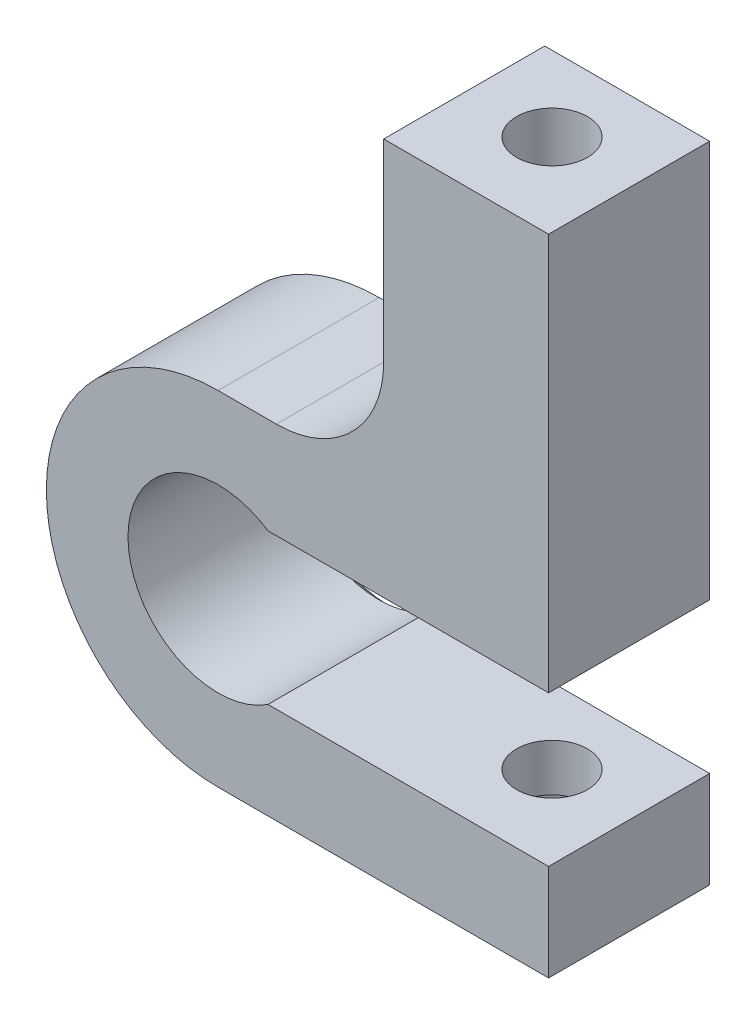
ISO-10303-21;
HEADER;
FILE_DESCRIPTION(('STEP AP214'),'2;1');
FILE_NAME('part.step','',(''),(''),'','','');
FILE_SCHEMA(('AUTOMOTIVE_DESIGN { 1 0 10303 214 1 1 1 1 }'));
ENDSEC;
DATA;
#1=APPLICATION_CONTEXT('core data for automotive mechanical design processes');
#2=APPLICATION_PROTOCOL_DEFINITION('international standard','automotive_design',2000,#1);
#3=PRODUCT_CONTEXT('',#1,'mechanical');
#4=PRODUCT('Part','Part','',(#3));
#5=PRODUCT_RELATED_PRODUCT_CATEGORY('part','',(#4));
#6=PRODUCT_DEFINITION_FORMATION('','',#4);
#7=PRODUCT_DEFINITION_CONTEXT('part definition',#1,'design');
#8=PRODUCT_DEFINITION('design','',#6,#7);
#9=PRODUCT_DEFINITION_SHAPE('','',#8);
#10=(LENGTH_UNIT() NAMED_UNIT(*) SI_UNIT(.MILLI.,.METRE.));
#11=(NAMED_UNIT(*) PLANE_ANGLE_UNIT() SI_UNIT($,.RADIAN.));
#12=(NAMED_UNIT(*) SI_UNIT($,.STERADIAN.) SOLID_ANGLE_UNIT());
#13=UNCERTAINTY_MEASURE_WITH_UNIT(LENGTH_MEASURE(1.E-05),#10,'distance_accuracy_value','');
#14=(GEOMETRIC_REPRESENTATION_CONTEXT(3) GLOBAL_UNCERTAINTY_ASSIGNED_CONTEXT((#13)) GLOBAL_UNIT_ASSIGNED_CONTEXT((#10,
#11,#12)) REPRESENTATION_CONTEXT('',''));
#15=CARTESIAN_POINT('',(0.,0.,0.));
#16=DIRECTION('',(0.,0.,1.));
#17=DIRECTION('',(1.,0.,0.));
#18=AXIS2_PLACEMENT_3D('',#15,#16,#17);
#19=CARTESIAN_POINT('',(11.54898322,8.,4.));
#20=DIRECTION('',(0.,-1.,0.));
#21=DIRECTION('',(0.,0.,-1.));
#22=AXIS2_PLACEMENT_3D('',#19,#20,#21);
#23=CYLINDRICAL_SURFACE('',#22,1.65);
#24=CARTESIAN_POINT('',(11.54898322,-3.5,4.));
#25=DIRECTION('',(0.,-1.,0.));
#26=DIRECTION('',(1.,0.,0.));
#27=AXIS2_PLACEMENT_3D('',#24,#25,#26);
#28=CIRCLE('',#27,1.65);
#29=CARTESIAN_POINT('',(13.19898322,-3.5,4.));
#30=VERTEX_POINT('',#29);
#31=EDGE_CURVE('E190',#30,#30,#28,.T.);
#32=ORIENTED_EDGE('',*,*,#31,.F.);
#33=EDGE_LOOP('',(#32));
#34=FACE_BOUND('',#33,.T.);
#35=CARTESIAN_POINT('',(11.54898322,-5.7,4.));
#36=DIRECTION('',(0.,-1.,0.));
#37=DIRECTION('',(0.,0.,-1.));
#38=AXIS2_PLACEMENT_3D('',#35,#36,#37);
#39=CIRCLE('',#38,1.65);
#40=CARTESIAN_POINT('',(11.54898322,-5.7,2.35));
#41=VERTEX_POINT('',#40);
#42=EDGE_CURVE('E183',#41,#41,#39,.F.);
#43=ORIENTED_EDGE('',*,*,#42,.F.);
#44=EDGE_LOOP('',(#43));
#45=FACE_BOUND('',#44,.T.);
#46=ADVANCED_FACE('F41',(#34,#45),#23,.F.);
#47=CARTESIAN_POINT('',(0.,0.,8.));
#48=DIRECTION('',(0.,0.,-1.));
#49=DIRECTION('',(-1.,0.,0.));
#50=AXIS2_PLACEMENT_3D('',#47,#48,#49);
#51=CYLINDRICAL_SURFACE('',#50,4.2);
#52=DIRECTION('',(0.,0.,-1.));
#53=VECTOR('',#52,1.);
#54=CARTESIAN_POINT('',(2.32163735324878,-3.5,8.));
#55=LINE('',#54,#53);
#56=CARTESIAN_POINT('',(2.32163735324878,-3.5,8.));
#57=VERTEX_POINT('',#56);
#58=CARTESIAN_POINT('',(2.32163735324878,-3.5,0.499999999999997));
#59=VERTEX_POINT('',#58);
#60=EDGE_CURVE('E202',#57,#59,#55,.T.);
#61=ORIENTED_EDGE('',*,*,#60,.T.);
#62=CARTESIAN_POINT('',(0.,0.,0.499999999999997));
#63=DIRECTION('',(0.,0.,1.));
#64=DIRECTION('',(1.,0.,0.));
#65=AXIS2_PLACEMENT_3D('',#62,#63,#64);
#66=CIRCLE('',#65,4.2);
#67=CARTESIAN_POINT('',(2.32163735324878,3.5,0.499999999999997));
#68=VERTEX_POINT('',#67);
#69=EDGE_CURVE('E259',#59,#68,#66,.F.);
#70=ORIENTED_EDGE('',*,*,#69,.T.);
#71=DIRECTION('',(0.,0.,-1.));
#72=VECTOR('',#71,1.);
#73=CARTESIAN_POINT('',(2.32163735324878,3.5,8.));
#74=LINE('',#73,#72);
#75=CARTESIAN_POINT('',(2.32163735324878,3.5,8.));
#76=VERTEX_POINT('',#75);
#77=EDGE_CURVE('E219',#76,#68,#74,.T.);
#78=ORIENTED_EDGE('',*,*,#77,.F.);
#79=CARTESIAN_POINT('',(0.,0.,8.));
#80=DIRECTION('',(0.,0.,-1.));
#81=DIRECTION('',(1.,0.,0.));
#82=AXIS2_PLACEMENT_3D('',#79,#80,#81);
#83=CIRCLE('',#82,4.2);
#84=EDGE_CURVE('E189',#57,#76,#83,.T.);
#85=ORIENTED_EDGE('',*,*,#84,.F.);
#86=EDGE_LOOP('',(#61,#70,#78,#85));
#87=FACE_BOUND('',#86,.T.);
#88=ADVANCED_FACE('F382',(#87),#51,.F.);
#89=CARTESIAN_POINT('',(15.38898322,3.5,8.));
#90=DIRECTION('',(0.,1.,0.));
#91=DIRECTION('',(-1.,0.,0.));
#92=AXIS2_PLACEMENT_3D('',#89,#90,#91);
#93=PLANE('',#92);
#94=ORIENTED_EDGE('',*,*,#77,.T.);
#95=DIRECTION('',(1.,0.,0.));
#96=VECTOR('',#95,1.);
#97=CARTESIAN_POINT('',(15.38898322,3.5,0.499999999999997));
#98=LINE('',#97,#96);
#99=CARTESIAN_POINT('',(15.38898322,3.5,0.499999999999997));
#100=VERTEX_POINT('',#99);
#101=EDGE_CURVE('E233',#68,#100,#98,.T.);
#102=ORIENTED_EDGE('',*,*,#101,.T.);
#103=DIRECTION('',(0.,0.,-1.));
#104=VECTOR('',#103,1.);
#105=CARTESIAN_POINT('',(15.38898322,3.5,8.));
#106=LINE('',#105,#104);
#107=CARTESIAN_POINT('',(15.38898322,3.5,8.));
#108=VERTEX_POINT('',#107);
#109=EDGE_CURVE('E217',#108,#100,#106,.T.);
#110=ORIENTED_EDGE('',*,*,#109,.F.);
#111=DIRECTION('',(1.,0.,0.));
#112=VECTOR('',#111,1.);
#113=CARTESIAN_POINT('',(15.38898322,3.5,8.));
#114=LINE('',#113,#112);
#115=EDGE_CURVE('E169',#76,#108,#114,.T.);
#116=ORIENTED_EDGE('',*,*,#115,.F.);
#117=EDGE_LOOP('',(#94,#102,#110,#116));
#118=FACE_BOUND('',#117,.T.);
#119=CARTESIAN_POINT('',(11.54898322,3.5,4.));
#120=DIRECTION('',(0.,1.,0.));
#121=DIRECTION('',(-1.,0.,0.));
#122=AXIS2_PLACEMENT_3D('',#119,#120,#121);
#123=CIRCLE('',#122,1.65);
#124=CARTESIAN_POINT('',(9.89898322,3.5,4.));
#125=VERTEX_POINT('',#124);
#126=EDGE_CURVE('E186',#125,#125,#123,.T.);
#127=ORIENTED_EDGE('',*,*,#126,.T.);
#128=EDGE_LOOP('',(#127));
#129=FACE_BOUND('',#128,.T.);
#130=ADVANCED_FACE('F390',(#118,#129),#93,.F.);
#131=CARTESIAN_POINT('',(15.38898322,8.,8.));
#132=DIRECTION('',(-1.,0.,0.));
#133=DIRECTION('',(0.,0.,1.));
#134=AXIS2_PLACEMENT_3D('',#131,#132,#133);
#135=PLANE('',#134);
#136=ORIENTED_EDGE('',*,*,#109,.T.);
#137=DIRECTION('',(0.,1.,0.));
#138=VECTOR('',#137,1.);
#139=CARTESIAN_POINT('',(15.38898322,8.,0.499999999999997));
#140=LINE('',#139,#138);
#141=CARTESIAN_POINT('',(15.38898322,22.,0.499999999999997));
#142=VERTEX_POINT('',#141);
#143=EDGE_CURVE('E11',#100,#142,#140,.T.);
#144=ORIENTED_EDGE('',*,*,#143,.T.);
#145=DIRECTION('',(0.,0.,1.));
#146=VECTOR('',#145,1.);
#147=CARTESIAN_POINT('',(15.38898322,22.,0.));
#148=LINE('',#147,#146);
#149=CARTESIAN_POINT('',(15.38898322,22.,8.));
#150=VERTEX_POINT('',#149);
#151=EDGE_CURVE('E156',#142,#150,#148,.T.);
#152=ORIENTED_EDGE('',*,*,#151,.T.);
#153=DIRECTION('',(0.,1.,0.));
#154=VECTOR('',#153,1.);
#155=CARTESIAN_POINT('',(15.38898322,8.,8.));
#156=LINE('',#155,#154);
#157=EDGE_CURVE('E159',#108,#150,#156,.T.);
#158=ORIENTED_EDGE('',*,*,#157,.F.);
#159=EDGE_LOOP('',(#136,#144,#152,#158));
#160=FACE_BOUND('',#159,.T.);
#161=ADVANCED_FACE('F158',(#160),#135,.F.);
#162=CARTESIAN_POINT('',(0.,8.,8.));
#163=DIRECTION('',(0.,-1.,0.));
#164=DIRECTION('',(0.,0.,-1.));
#165=AXIS2_PLACEMENT_3D('',#162,#163,#164);
#166=PLANE('',#165);
#167=DIRECTION('',(0.,0.,-1.));
#168=VECTOR('',#167,1.);
#169=CARTESIAN_POINT('',(2.70898322,8.,8.));
#170=LINE('',#169,#168);
#171=CARTESIAN_POINT('',(2.70898322,8.,8.));
#172=VERTEX_POINT('',#171);
#173=CARTESIAN_POINT('',(2.70898322,8.,0.499999999999997));
#174=VERTEX_POINT('',#173);
#175=EDGE_CURVE('E222',#172,#174,#170,.T.);
#176=ORIENTED_EDGE('',*,*,#175,.T.);
#177=DIRECTION('',(-1.,0.,0.));
#178=VECTOR('',#177,1.);
#179=CARTESIAN_POINT('',(0.,8.,0.499999999999997));
#180=LINE('',#179,#178);
#181=CARTESIAN_POINT('',(0.,8.,0.499999999999997));
#182=VERTEX_POINT('',#181);
#183=EDGE_CURVE('E269',#174,#182,#180,.T.);
#184=ORIENTED_EDGE('',*,*,#183,.T.);
#185=DIRECTION('',(0.,0.,-1.));
#186=VECTOR('',#185,1.);
#187=CARTESIAN_POINT('',(0.,8.,8.));
#188=LINE('',#187,#186);
#189=CARTESIAN_POINT('',(0.,8.,8.));
#190=VERTEX_POINT('',#189);
#191=EDGE_CURVE('E214',#190,#182,#188,.T.);
#192=ORIENTED_EDGE('',*,*,#191,.F.);
#193=DIRECTION('',(-1.,0.,0.));
#194=VECTOR('',#193,1.);
#195=CARTESIAN_POINT('',(0.,8.,8.));
#196=LINE('',#195,#194);
#197=EDGE_CURVE('E171',#172,#190,#196,.T.);
#198=ORIENTED_EDGE('',*,*,#197,.F.);
#199=EDGE_LOOP('',(#176,#184,#192,#198));
#200=FACE_BOUND('',#199,.T.);
#201=ADVANCED_FACE('F370',(#200),#166,.F.);
#202=CARTESIAN_POINT('',(0.,0.,8.));
#203=DIRECTION('',(0.,0.,-1.));
#204=DIRECTION('',(-1.,0.,0.));
#205=AXIS2_PLACEMENT_3D('',#202,#203,#204);
#206=CYLINDRICAL_SURFACE('',#205,8.);
#207=ORIENTED_EDGE('',*,*,#191,.T.);
#208=CARTESIAN_POINT('',(0.,0.,0.499999999999997));
#209=DIRECTION('',(0.,0.,1.));
#210=DIRECTION('',(1.,0.,0.));
#211=AXIS2_PLACEMENT_3D('',#208,#209,#210);
#212=CIRCLE('',#211,8.);
#213=CARTESIAN_POINT('',(0.,-8.,0.499999999999997));
#214=VERTEX_POINT('',#213);
#215=EDGE_CURVE('E267',#182,#214,#212,.T.);
#216=ORIENTED_EDGE('',*,*,#215,.T.);
#217=DIRECTION('',(0.,0.,-1.));
#218=VECTOR('',#217,1.);
#219=CARTESIAN_POINT('',(0.,-8.,8.));
#220=LINE('',#219,#218);
#221=CARTESIAN_POINT('',(0.,-8.,8.));
#222=VERTEX_POINT('',#221);
#223=EDGE_CURVE('E211',#222,#214,#220,.T.);
#224=ORIENTED_EDGE('',*,*,#223,.F.);
#225=CARTESIAN_POINT('',(0.,0.,8.));
#226=DIRECTION('',(0.,0.,1.));
#227=DIRECTION('',(1.,0.,0.));
#228=AXIS2_PLACEMENT_3D('',#225,#226,#227);
#229=CIRCLE('',#228,8.);
#230=EDGE_CURVE('E194',#190,#222,#229,.T.);
#231=ORIENTED_EDGE('',*,*,#230,.F.);
#232=EDGE_LOOP('',(#207,#216,#224,#231));
#233=FACE_BOUND('',#232,.T.);
#234=ADVANCED_FACE('F443',(#233),#206,.T.);
#235=CARTESIAN_POINT('',(0.,-8.,8.));
#236=DIRECTION('',(0.,1.,0.));
#237=DIRECTION('',(0.,0.,1.));
#238=AXIS2_PLACEMENT_3D('',#235,#236,#237);
#239=PLANE('',#238);
#240=CARTESIAN_POINT('',(11.54898322,-8.,4.));
#241=DIRECTION('',(0.,-1.,0.));
#242=DIRECTION('',(0.,0.,-1.));
#243=AXIS2_PLACEMENT_3D('',#240,#241,#242);
#244=CIRCLE('',#243,3.);
#245=CARTESIAN_POINT('',(11.54898322,-8.,0.999999999999999));
#246=VERTEX_POINT('',#245);
#247=EDGE_CURVE('E176',#246,#246,#244,.T.);
#248=ORIENTED_EDGE('',*,*,#247,.F.);
#249=EDGE_LOOP('',(#248));
#250=FACE_BOUND('',#249,.T.);
#251=ORIENTED_EDGE('',*,*,#223,.T.);
#252=DIRECTION('',(1.,0.,0.));
#253=VECTOR('',#252,1.);
#254=CARTESIAN_POINT('',(0.,-8.,0.499999999999997));
#255=LINE('',#254,#253);
#256=CARTESIAN_POINT('',(15.38898322,-8.,0.499999999999997));
#257=VERTEX_POINT('',#256);
#258=EDGE_CURVE('E265',#214,#257,#255,.T.);
#259=ORIENTED_EDGE('',*,*,#258,.T.);
#260=DIRECTION('',(0.,0.,-1.));
#261=VECTOR('',#260,1.);
#262=CARTESIAN_POINT('',(15.38898322,-8.,8.));
#263=LINE('',#262,#261);
#264=CARTESIAN_POINT('',(15.38898322,-8.,8.));
#265=VERTEX_POINT('',#264);
#266=EDGE_CURVE('E208',#265,#257,#263,.T.);
#267=ORIENTED_EDGE('',*,*,#266,.F.);
#268=DIRECTION('',(1.,0.,0.));
#269=VECTOR('',#268,1.);
#270=CARTESIAN_POINT('',(0.,-8.,8.));
#271=LINE('',#270,#269);
#272=EDGE_CURVE('E196',#222,#265,#271,.T.);
#273=ORIENTED_EDGE('',*,*,#272,.F.);
#274=EDGE_LOOP('',(#251,#259,#267,#273));
#275=FACE_BOUND('',#274,.T.);
#276=ADVANCED_FACE('F439',(#250,#275),#239,.F.);
#277=CARTESIAN_POINT('',(15.38898322,-8.,8.));
#278=DIRECTION('',(-1.,0.,0.));
#279=DIRECTION('',(0.,0.,1.));
#280=AXIS2_PLACEMENT_3D('',#277,#278,#279);
#281=PLANE('',#280);
#282=ORIENTED_EDGE('',*,*,#266,.T.);
#283=DIRECTION('',(0.,1.,0.));
#284=VECTOR('',#283,1.);
#285=CARTESIAN_POINT('',(15.38898322,-8.,0.499999999999997));
#286=LINE('',#285,#284);
#287=CARTESIAN_POINT('',(15.38898322,-3.5,0.499999999999997));
#288=VERTEX_POINT('',#287);
#289=EDGE_CURVE('E263',#257,#288,#286,.T.);
#290=ORIENTED_EDGE('',*,*,#289,.T.);
#291=DIRECTION('',(0.,0.,-1.));
#292=VECTOR('',#291,1.);
#293=CARTESIAN_POINT('',(15.38898322,-3.5,8.));
#294=LINE('',#293,#292);
#295=CARTESIAN_POINT('',(15.38898322,-3.5,8.));
#296=VERTEX_POINT('',#295);
#297=EDGE_CURVE('E205',#296,#288,#294,.T.);
#298=ORIENTED_EDGE('',*,*,#297,.F.);
#299=DIRECTION('',(0.,1.,0.));
#300=VECTOR('',#299,1.);
#301=CARTESIAN_POINT('',(15.38898322,-8.,8.));
#302=LINE('',#301,#300);
#303=EDGE_CURVE('E198',#265,#296,#302,.T.);
#304=ORIENTED_EDGE('',*,*,#303,.F.);
#305=EDGE_LOOP('',(#282,#290,#298,#304));
#306=FACE_BOUND('',#305,.T.);
#307=ADVANCED_FACE('F442',(#306),#281,.F.);
#308=CARTESIAN_POINT('',(15.38898322,-3.5,8.));
#309=DIRECTION('',(0.,-1.,0.));
#310=DIRECTION('',(1.,0.,0.));
#311=AXIS2_PLACEMENT_3D('',#308,#309,#310);
#312=PLANE('',#311);
#313=ORIENTED_EDGE('',*,*,#31,.T.);
#314=EDGE_LOOP('',(#313));
#315=FACE_BOUND('',#314,.T.);
#316=ORIENTED_EDGE('',*,*,#297,.T.);
#317=DIRECTION('',(-1.,0.,0.));
#318=VECTOR('',#317,1.);
#319=CARTESIAN_POINT('',(15.38898322,-3.5,0.499999999999997));
#320=LINE('',#319,#318);
#321=EDGE_CURVE('E261',#288,#59,#320,.T.);
#322=ORIENTED_EDGE('',*,*,#321,.T.);
#323=ORIENTED_EDGE('',*,*,#60,.F.);
#324=DIRECTION('',(-1.,0.,0.));
#325=VECTOR('',#324,1.);
#326=CARTESIAN_POINT('',(15.38898322,-3.5,8.));
#327=LINE('',#326,#325);
#328=EDGE_CURVE('E200',#296,#57,#327,.T.);
#329=ORIENTED_EDGE('',*,*,#328,.F.);
#330=EDGE_LOOP('',(#316,#322,#323,#329));
#331=FACE_BOUND('',#330,.T.);
#332=ADVANCED_FACE('F464',(#315,#331),#312,.F.);
#333=CARTESIAN_POINT('',(0.,0.,8.));
#334=DIRECTION('',(0.,0.,1.));
#335=DIRECTION('',(1.,0.,0.));
#336=AXIS2_PLACEMENT_3D('',#333,#334,#335);
#337=PLANE('',#336);
#338=ORIENTED_EDGE('',*,*,#115,.T.);
#339=ORIENTED_EDGE('',*,*,#157,.T.);
#340=DIRECTION('',(-1.,0.,0.));
#341=VECTOR('',#340,1.);
#342=CARTESIAN_POINT('',(15.38898322,22.,8.));
#343=LINE('',#342,#341);
#344=CARTESIAN_POINT('',(7.70898322,22.,8.));
#345=VERTEX_POINT('',#344);
#346=EDGE_CURVE('E161',#150,#345,#343,.T.);
#347=ORIENTED_EDGE('',*,*,#346,.T.);
#348=DIRECTION('',(0.,-1.,0.));
#349=VECTOR('',#348,1.);
#350=CARTESIAN_POINT('',(7.70898322,22.,8.));
#351=LINE('',#350,#349);
#352=CARTESIAN_POINT('',(7.70898322,13.,8.));
#353=VERTEX_POINT('',#352);
#354=EDGE_CURVE('E174',#345,#353,#351,.T.);
#355=ORIENTED_EDGE('',*,*,#354,.T.);
#356=CARTESIAN_POINT('',(2.70898322,13.,8.));
#357=DIRECTION('',(0.,0.,1.));
#358=DIRECTION('',(1.,0.,0.));
#359=AXIS2_PLACEMENT_3D('',#356,#357,#358);
#360=CIRCLE('',#359,5.);
#361=EDGE_CURVE('E231',#353,#172,#360,.F.);
#362=ORIENTED_EDGE('',*,*,#361,.T.);
#363=ORIENTED_EDGE('',*,*,#197,.T.);
#364=ORIENTED_EDGE('',*,*,#230,.T.);
#365=ORIENTED_EDGE('',*,*,#272,.T.);
#366=ORIENTED_EDGE('',*,*,#303,.T.);
#367=ORIENTED_EDGE('',*,*,#328,.T.);
#368=ORIENTED_EDGE('',*,*,#84,.T.);
#369=EDGE_LOOP('',(#338,#339,#347,#355,#362,#363,#364,#365,#366,#367,#368));
#370=FACE_BOUND('',#369,.T.);
#371=ADVANCED_FACE('F166',(#370),#337,.T.);
#372=CARTESIAN_POINT('',(0.,0.,0.));
#373=DIRECTION('',(0.,0.,1.));
#374=DIRECTION('',(1.,0.,0.));
#375=AXIS2_PLACEMENT_3D('',#372,#373,#374);
#376=PLANE('',#375);
#377=DIRECTION('',(0.,-1.,0.));
#378=VECTOR('',#377,1.);
#379=CARTESIAN_POINT('',(14.88898322,0.,0.));
#380=LINE('',#379,#378);
#381=CARTESIAN_POINT('',(14.88898322,21.5,0.));
#382=VERTEX_POINT('',#381);
#383=CARTESIAN_POINT('',(14.88898322,4.,0.));
#384=VERTEX_POINT('',#383);
#385=EDGE_CURVE('E236',#382,#384,#380,.T.);
#386=ORIENTED_EDGE('',*,*,#385,.T.);
#387=DIRECTION('',(-1.,0.,0.));
#388=VECTOR('',#387,1.);
#389=CARTESIAN_POINT('',(0.,4.,0.));
#390=LINE('',#389,#388);
#391=CARTESIAN_POINT('',(2.46779253585164,3.99999999999937,0.));
#392=VERTEX_POINT('',#391);
#393=EDGE_CURVE('E256',#384,#392,#390,.T.);
#394=ORIENTED_EDGE('',*,*,#393,.T.);
#395=CARTESIAN_POINT('',(0.,0.,0.));
#396=DIRECTION('',(0.,0.,1.));
#397=DIRECTION('',(1.,0.,0.));
#398=AXIS2_PLACEMENT_3D('',#395,#396,#397);
#399=CIRCLE('',#398,4.7);
#400=CARTESIAN_POINT('',(2.46779253585164,-4.,0.));
#401=VERTEX_POINT('',#400);
#402=EDGE_CURVE('E254',#392,#401,#399,.T.);
#403=ORIENTED_EDGE('',*,*,#402,.T.);
#404=DIRECTION('',(1.,0.,0.));
#405=VECTOR('',#404,1.);
#406=CARTESIAN_POINT('',(0.,-4.,0.));
#407=LINE('',#406,#405);
#408=CARTESIAN_POINT('',(14.88898322,-4.,0.));
#409=VERTEX_POINT('',#408);
#410=EDGE_CURVE('E252',#401,#409,#407,.T.);
#411=ORIENTED_EDGE('',*,*,#410,.T.);
#412=DIRECTION('',(0.,-1.,0.));
#413=VECTOR('',#412,1.);
#414=CARTESIAN_POINT('',(14.88898322,0.,0.));
#415=LINE('',#414,#413);
#416=CARTESIAN_POINT('',(14.88898322,-7.5,0.));
#417=VERTEX_POINT('',#416);
#418=EDGE_CURVE('E250',#409,#417,#415,.T.);
#419=ORIENTED_EDGE('',*,*,#418,.T.);
#420=DIRECTION('',(-1.,0.,0.));
#421=VECTOR('',#420,1.);
#422=CARTESIAN_POINT('',(0.,-7.5,0.));
#423=LINE('',#422,#421);
#424=CARTESIAN_POINT('',(0.,-7.5,0.));
#425=VERTEX_POINT('',#424);
#426=EDGE_CURVE('E248',#417,#425,#423,.T.);
#427=ORIENTED_EDGE('',*,*,#426,.T.);
#428=CARTESIAN_POINT('',(0.,0.,0.));
#429=DIRECTION('',(0.,0.,1.));
#430=DIRECTION('',(1.,0.,0.));
#431=AXIS2_PLACEMENT_3D('',#428,#429,#430);
#432=CIRCLE('',#431,7.5);
#433=CARTESIAN_POINT('',(0.,7.5,0.));
#434=VERTEX_POINT('',#433);
#435=EDGE_CURVE('E246',#425,#434,#432,.F.);
#436=ORIENTED_EDGE('',*,*,#435,.T.);
#437=DIRECTION('',(1.,0.,0.));
#438=VECTOR('',#437,1.);
#439=CARTESIAN_POINT('',(0.,7.5,0.));
#440=LINE('',#439,#438);
#441=CARTESIAN_POINT('',(2.70898322,7.5,0.));
#442=VERTEX_POINT('',#441);
#443=EDGE_CURVE('E244',#434,#442,#440,.T.);
#444=ORIENTED_EDGE('',*,*,#443,.T.);
#445=CARTESIAN_POINT('',(2.70898322,13.,0.));
#446=DIRECTION('',(0.,0.,1.));
#447=DIRECTION('',(1.,0.,0.));
#448=AXIS2_PLACEMENT_3D('',#445,#446,#447);
#449=CIRCLE('',#448,5.5);
#450=CARTESIAN_POINT('',(8.20898322,13.,0.));
#451=VERTEX_POINT('',#450);
#452=EDGE_CURVE('E242',#442,#451,#449,.T.);
#453=ORIENTED_EDGE('',*,*,#452,.T.);
#454=DIRECTION('',(0.,1.,0.));
#455=VECTOR('',#454,1.);
#456=CARTESIAN_POINT('',(8.20898322,22.,0.));
#457=LINE('',#456,#455);
#458=CARTESIAN_POINT('',(8.20898322,21.5,0.));
#459=VERTEX_POINT('',#458);
#460=EDGE_CURVE('E240',#451,#459,#457,.T.);
#461=ORIENTED_EDGE('',*,*,#460,.T.);
#462=DIRECTION('',(1.,0.,0.));
#463=VECTOR('',#462,1.);
#464=CARTESIAN_POINT('',(0.,21.5,0.));
#465=LINE('',#464,#463);
#466=EDGE_CURVE('E238',#459,#382,#465,.T.);
#467=ORIENTED_EDGE('',*,*,#466,.T.);
#468=EDGE_LOOP('',(#386,#394,#403,#411,#419,#427,#436,#444,#453,#461,#467));
#469=FACE_BOUND('',#468,.T.);
#470=ADVANCED_FACE('F357',(#469),#376,.F.);
#471=ORIENTED_EDGE('',*,*,#126,.F.);
#472=EDGE_LOOP('',(#471));
#473=FACE_BOUND('',#472,.T.);
#474=CARTESIAN_POINT('',(11.54898322,22.,4.));
#475=DIRECTION('',(0.,-1.,0.));
#476=DIRECTION('',(1.,0.,0.));
#477=AXIS2_PLACEMENT_3D('',#474,#475,#476);
#478=CIRCLE('',#477,1.65);
#479=CARTESIAN_POINT('',(13.19898322,22.,4.));
#480=VERTEX_POINT('',#479);
#481=EDGE_CURVE('E334',#480,#480,#478,.T.);
#482=ORIENTED_EDGE('',*,*,#481,.F.);
#483=EDGE_LOOP('',(#482));
#484=FACE_BOUND('',#483,.T.);
#485=ADVANCED_FACE('F385',(#473,#484),#23,.F.);
#486=CARTESIAN_POINT('',(11.54898322,-5.7,4.));
#487=DIRECTION('',(0.,-1.,0.));
#488=DIRECTION('',(0.,0.,-1.));
#489=AXIS2_PLACEMENT_3D('',#486,#487,#488);
#490=PLANE('',#489);
#491=CARTESIAN_POINT('',(11.54898322,-5.7,4.));
#492=DIRECTION('',(0.,-1.,0.));
#493=DIRECTION('',(0.,0.,-1.));
#494=AXIS2_PLACEMENT_3D('',#491,#492,#493);
#495=CIRCLE('',#494,3.);
#496=CARTESIAN_POINT('',(11.54898322,-5.7,0.999999999999999));
#497=VERTEX_POINT('',#496);
#498=EDGE_CURVE('E180',#497,#497,#495,.T.);
#499=ORIENTED_EDGE('',*,*,#498,.T.);
#500=EDGE_LOOP('',(#499));
#501=FACE_BOUND('',#500,.T.);
#502=ORIENTED_EDGE('',*,*,#42,.T.);
#503=EDGE_LOOP('',(#502));
#504=FACE_BOUND('',#503,.T.);
#505=ADVANCED_FACE('F398',(#501,#504),#490,.T.);
#506=CARTESIAN_POINT('',(11.54898322,-5.7,4.));
#507=DIRECTION('',(0.,-1.,0.));
#508=DIRECTION('',(0.,0.,-1.));
#509=AXIS2_PLACEMENT_3D('',#506,#507,#508);
#510=CYLINDRICAL_SURFACE('',#509,3.);
#511=ORIENTED_EDGE('',*,*,#498,.F.);
#512=EDGE_LOOP('',(#511));
#513=FACE_BOUND('',#512,.T.);
#514=ORIENTED_EDGE('',*,*,#247,.T.);
#515=EDGE_LOOP('',(#514));
#516=FACE_BOUND('',#515,.T.);
#517=ADVANCED_FACE('F404',(#513,#516),#510,.F.);
#518=CARTESIAN_POINT('',(7.70898322,22.,8.));
#519=DIRECTION('',(-1.,0.,0.));
#520=DIRECTION('',(0.,0.,1.));
#521=AXIS2_PLACEMENT_3D('',#518,#519,#520);
#522=PLANE('',#521);
#523=DIRECTION('',(0.,0.,-1.));
#524=VECTOR('',#523,1.);
#525=CARTESIAN_POINT('',(7.70898322,22.,8.));
#526=LINE('',#525,#524);
#527=CARTESIAN_POINT('',(7.70898322,22.,0.499999999999997));
#528=VERTEX_POINT('',#527);
#529=EDGE_CURVE('E162',#345,#528,#526,.T.);
#530=ORIENTED_EDGE('',*,*,#529,.T.);
#531=DIRECTION('',(0.,-1.,0.));
#532=VECTOR('',#531,1.);
#533=CARTESIAN_POINT('',(7.70898322,13.,0.499999999999997));
#534=LINE('',#533,#532);
#535=CARTESIAN_POINT('',(7.70898322,13.,0.499999999999997));
#536=VERTEX_POINT('',#535);
#537=EDGE_CURVE('E273',#528,#536,#534,.T.);
#538=ORIENTED_EDGE('',*,*,#537,.T.);
#539=DIRECTION('',(0.,0.,-1.));
#540=VECTOR('',#539,1.);
#541=CARTESIAN_POINT('',(7.70898322,13.,8.));
#542=LINE('',#541,#540);
#543=EDGE_CURVE('E229',#536,#353,#542,.F.);
#544=ORIENTED_EDGE('',*,*,#543,.T.);
#545=ORIENTED_EDGE('',*,*,#354,.F.);
#546=EDGE_LOOP('',(#530,#538,#544,#545));
#547=FACE_BOUND('',#546,.T.);
#548=ADVANCED_FACE('F345',(#547),#522,.T.);
#549=CARTESIAN_POINT('',(0.,22.,0.));
#550=DIRECTION('',(0.,-1.,0.));
#551=DIRECTION('',(1.,0.,0.));
#552=AXIS2_PLACEMENT_3D('',#549,#550,#551);
#553=PLANE('',#552);
#554=ORIENTED_EDGE('',*,*,#481,.T.);
#555=EDGE_LOOP('',(#554));
#556=FACE_BOUND('',#555,.T.);
#557=ORIENTED_EDGE('',*,*,#151,.F.);
#558=DIRECTION('',(-1.,0.,0.));
#559=VECTOR('',#558,1.);
#560=CARTESIAN_POINT('',(0.,22.,0.499999999999997));
#561=LINE('',#560,#559);
#562=EDGE_CURVE('E50',#142,#528,#561,.T.);
#563=ORIENTED_EDGE('',*,*,#562,.T.);
#564=ORIENTED_EDGE('',*,*,#529,.F.);
#565=ORIENTED_EDGE('',*,*,#346,.F.);
#566=EDGE_LOOP('',(#557,#563,#564,#565));
#567=FACE_BOUND('',#566,.T.);
#568=ADVANCED_FACE('F173',(#556,#567),#553,.F.);
#569=CARTESIAN_POINT('',(2.70898322,13.,8.));
#570=DIRECTION('',(0.,0.,-1.));
#571=DIRECTION('',(-1.,0.,0.));
#572=AXIS2_PLACEMENT_3D('',#569,#570,#571);
#573=CYLINDRICAL_SURFACE('',#572,5.);
#574=ORIENTED_EDGE('',*,*,#543,.F.);
#575=CARTESIAN_POINT('',(2.70898322,13.,0.499999999999997));
#576=DIRECTION('',(0.,0.,1.));
#577=DIRECTION('',(1.,0.,0.));
#578=AXIS2_PLACEMENT_3D('',#575,#576,#577);
#579=CIRCLE('',#578,5.);
#580=EDGE_CURVE('E271',#536,#174,#579,.F.);
#581=ORIENTED_EDGE('',*,*,#580,.T.);
#582=ORIENTED_EDGE('',*,*,#175,.F.);
#583=ORIENTED_EDGE('',*,*,#361,.F.);
#584=EDGE_LOOP('',(#574,#581,#582,#583));
#585=FACE_BOUND('',#584,.T.);
#586=ADVANCED_FACE('F366',(#585),#573,.F.);
#587=CARTESIAN_POINT('',(0.,0.,0.499999999999997));
#588=DIRECTION('',(0.,0.,1.));
#589=DIRECTION('',(1.,0.,0.));
#590=AXIS2_PLACEMENT_3D('',#587,#588,#589);
#591=CONICAL_SURFACE('',#590,8.,0.785398163397452);
#592=DIRECTION('',(0.,0.70710678118655,-0.707106781186545));
#593=VECTOR('',#592,1.);
#594=CARTESIAN_POINT('',(0.,-8.,0.499999999999997));
#595=LINE('',#594,#593);
#596=EDGE_CURVE('E327',#214,#425,#595,.T.);
#597=ORIENTED_EDGE('',*,*,#596,.F.);
#598=ORIENTED_EDGE('',*,*,#215,.F.);
#599=DIRECTION('',(0.,0.70710678118655,0.707106781186545));
#600=VECTOR('',#599,1.);
#601=CARTESIAN_POINT('',(0.,7.5,0.));
#602=LINE('',#601,#600);
#603=EDGE_CURVE('E45',#434,#182,#602,.T.);
#604=ORIENTED_EDGE('',*,*,#603,.F.);
#605=ORIENTED_EDGE('',*,*,#435,.F.);
#606=EDGE_LOOP('',(#597,#598,#604,#605));
#607=FACE_BOUND('',#606,.T.);
#608=ADVANCED_FACE('F43',(#607),#591,.T.);
#609=CARTESIAN_POINT('',(0.,8.,0.499999999999997));
#610=DIRECTION('',(0.,-0.707106781186545,0.70710678118655));
#611=DIRECTION('',(-1.,0.,0.));
#612=AXIS2_PLACEMENT_3D('',#609,#610,#611);
#613=PLANE('',#612);
#614=ORIENTED_EDGE('',*,*,#603,.T.);
#615=ORIENTED_EDGE('',*,*,#183,.F.);
#616=DIRECTION('',(0.,0.70710678118655,0.707106781186545));
#617=VECTOR('',#616,1.);
#618=CARTESIAN_POINT('',(2.70898322,7.5,0.));
#619=LINE('',#618,#617);
#620=EDGE_CURVE('E325',#442,#174,#619,.T.);
#621=ORIENTED_EDGE('',*,*,#620,.F.);
#622=ORIENTED_EDGE('',*,*,#443,.F.);
#623=EDGE_LOOP('',(#614,#615,#621,#622));
#624=FACE_BOUND('',#623,.T.);
#625=ADVANCED_FACE('F372',(#624),#613,.F.);
#626=CARTESIAN_POINT('',(0.,-8.,0.499999999999997));
#627=DIRECTION('',(0.,0.707106781186545,0.70710678118655));
#628=DIRECTION('',(1.,0.,0.));
#629=AXIS2_PLACEMENT_3D('',#626,#627,#628);
#630=PLANE('',#629);
#631=ORIENTED_EDGE('',*,*,#596,.T.);
#632=ORIENTED_EDGE('',*,*,#426,.F.);
#633=DIRECTION('',(0.577350269189627,-0.577350269189627,0.577350269189623));
#634=VECTOR('',#633,1.);
#635=CARTESIAN_POINT('',(10.2593221466666,-2.87033892666665,-4.62966107333332));
#636=LINE('',#635,#634);
#637=EDGE_CURVE('E322',#257,#417,#636,.F.);
#638=ORIENTED_EDGE('',*,*,#637,.F.);
#639=ORIENTED_EDGE('',*,*,#258,.F.);
#640=EDGE_LOOP('',(#631,#632,#638,#639));
#641=FACE_BOUND('',#640,.T.);
#642=ADVANCED_FACE('F374',(#641),#630,.F.);
#643=CARTESIAN_POINT('',(2.70898322,13.,0.));
#644=DIRECTION('',(0.,0.,-1.));
#645=DIRECTION('',(-1.,0.,0.));
#646=AXIS2_PLACEMENT_3D('',#643,#644,#645);
#647=CONICAL_SURFACE('',#646,5.5,0.785398163397452);
#648=ORIENTED_EDGE('',*,*,#620,.T.);
#649=ORIENTED_EDGE('',*,*,#580,.F.);
#650=DIRECTION('',(-0.707106781186549,0.,0.707106781186546));
#651=VECTOR('',#650,1.);
#652=CARTESIAN_POINT('',(8.20898322,13.,0.));
#653=LINE('',#652,#651);
#654=EDGE_CURVE('E319',#451,#536,#653,.T.);
#655=ORIENTED_EDGE('',*,*,#654,.F.);
#656=ORIENTED_EDGE('',*,*,#452,.F.);
#657=EDGE_LOOP('',(#648,#649,#655,#656));
#658=FACE_BOUND('',#657,.T.);
#659=ADVANCED_FACE('F363',(#658),#647,.F.);
#660=CARTESIAN_POINT('',(15.38898322,-8.,0.499999999999997));
#661=DIRECTION('',(-0.707106781186545,0.,0.70710678118655));
#662=DIRECTION('',(0.,1.,0.));
#663=AXIS2_PLACEMENT_3D('',#660,#661,#662);
#664=PLANE('',#663);
#665=ORIENTED_EDGE('',*,*,#637,.T.);
#666=ORIENTED_EDGE('',*,*,#418,.F.);
#667=DIRECTION('',(0.577350269189627,0.577350269189627,0.577350269189623));
#668=VECTOR('',#667,1.);
#669=CARTESIAN_POINT('',(13.88898322,-5.00000000000001,-0.999999999999999));
#670=LINE('',#669,#668);
#671=EDGE_CURVE('E316',#288,#409,#670,.F.);
#672=ORIENTED_EDGE('',*,*,#671,.F.);
#673=ORIENTED_EDGE('',*,*,#289,.F.);
#674=EDGE_LOOP('',(#665,#666,#672,#673));
#675=FACE_BOUND('',#674,.T.);
#676=ADVANCED_FACE('F457',(#675),#664,.F.);
#677=CARTESIAN_POINT('',(7.70898322,22.,0.499999999999997));
#678=DIRECTION('',(-0.707106781186545,0.,-0.70710678118655));
#679=DIRECTION('',(0.,1.,0.));
#680=AXIS2_PLACEMENT_3D('',#677,#678,#679);
#681=PLANE('',#680);
#682=ORIENTED_EDGE('',*,*,#654,.T.);
#683=ORIENTED_EDGE('',*,*,#537,.F.);
#684=DIRECTION('',(0.577350269189627,-0.577350269189627,-0.577350269189623));
#685=VECTOR('',#684,1.);
#686=CARTESIAN_POINT('',(5.47265547999999,24.23632774,2.73632773999999));
#687=LINE('',#686,#685);
#688=EDGE_CURVE('E313',#459,#528,#687,.F.);
#689=ORIENTED_EDGE('',*,*,#688,.F.);
#690=ORIENTED_EDGE('',*,*,#460,.F.);
#691=EDGE_LOOP('',(#682,#683,#689,#690));
#692=FACE_BOUND('',#691,.T.);
#693=ADVANCED_FACE('F304',(#692),#681,.T.);
#694=CARTESIAN_POINT('',(15.38898322,-3.5,0.499999999999997));
#695=DIRECTION('',(0.,-0.707106781186545,0.70710678118655));
#696=DIRECTION('',(-1.,0.,0.));
#697=AXIS2_PLACEMENT_3D('',#694,#695,#696);
#698=PLANE('',#697);
#699=ORIENTED_EDGE('',*,*,#671,.T.);
#700=ORIENTED_EDGE('',*,*,#410,.F.);
#701=CARTESIAN_POINT('',(2.46779253585164,-3.99999999999937,0.));
#702=CARTESIAN_POINT('',(2.44414609164096,-3.91656253879377,0.0834374612059126));
#703=CARTESIAN_POINT('',(2.42014327742787,-3.83317716291049,0.166822837089405));
#704=CARTESIAN_POINT('',(2.37142488395999,-3.66651049613689,0.33348950386321));
#705=CARTESIAN_POINT('',(2.34670930397263,-3.58322920535365,0.416770794646455));
#706=CARTESIAN_POINT('',(2.32163735325029,-3.49999999999979,0.500000000000211));
#707=B_SPLINE_CURVE_WITH_KNOTS('',3,(#701,#702,#703,#704,#705,#706),.UNSPECIFIED.,.F.,.F.,(4,2,
4),(0.,0.36102824295778,0.722056856987784),.UNSPECIFIED.);
#708=EDGE_CURVE('E307',#59,#401,#707,.F.);
#709=ORIENTED_EDGE('',*,*,#708,.F.);
#710=ORIENTED_EDGE('',*,*,#321,.F.);
#711=EDGE_LOOP('',(#699,#700,#709,#710));
#712=FACE_BOUND('',#711,.T.);
#713=ADVANCED_FACE('F299',(#712),#698,.F.);
#714=CARTESIAN_POINT('',(0.,21.5,0.));
#715=DIRECTION('',(0.,-0.707106781186545,0.70710678118655));
#716=DIRECTION('',(1.,0.,0.));
#717=AXIS2_PLACEMENT_3D('',#714,#715,#716);
#718=PLANE('',#717);
#719=ORIENTED_EDGE('',*,*,#688,.T.);
#720=ORIENTED_EDGE('',*,*,#562,.F.);
#721=DIRECTION('',(0.577350269189627,0.577350269189627,0.577350269189623));
#722=VECTOR('',#721,1.);
#723=CARTESIAN_POINT('',(10.7223165533333,17.3333333333333,-4.16666666666666));
#724=LINE('',#723,#722);
#725=EDGE_CURVE('E285',#382,#142,#724,.T.);
#726=ORIENTED_EDGE('',*,*,#725,.F.);
#727=ORIENTED_EDGE('',*,*,#466,.F.);
#728=EDGE_LOOP('',(#719,#720,#726,#727));
#729=FACE_BOUND('',#728,.T.);
#730=ADVANCED_FACE('F303',(#729),#718,.F.);
#731=CARTESIAN_POINT('',(0.,0.,0.499999999999997));
#732=DIRECTION('',(0.,0.,-1.));
#733=DIRECTION('',(-1.,0.,0.));
#734=AXIS2_PLACEMENT_3D('',#731,#732,#733);
#735=CONICAL_SURFACE('',#734,4.2,0.785398163397452);
#736=ORIENTED_EDGE('',*,*,#708,.T.);
#737=ORIENTED_EDGE('',*,*,#402,.F.);
#738=CARTESIAN_POINT('',(2.46779253585203,4.,0.));
#739=CARTESIAN_POINT('',(2.44414609164119,3.9165625387942,0.083437461205794));
#740=CARTESIAN_POINT('',(2.42014327742798,3.83317716291077,0.166822837089227));
#741=CARTESIAN_POINT('',(2.37142488395998,3.66651049613697,0.333489503863032));
#742=CARTESIAN_POINT('',(2.3467093039726,3.58322920535366,0.416770794646337));
#743=CARTESIAN_POINT('',(2.32163735325029,3.49999999999979,0.500000000000211));
#744=B_SPLINE_CURVE_WITH_KNOTS('',3,(#738,#739,#740,#741,#742,#743),.UNSPECIFIED.,.F.,.F.,(4,2,
4),(0.,0.361028242958037,0.722056856988297),.UNSPECIFIED.);
#745=EDGE_CURVE('E278',#68,#392,#744,.F.);
#746=ORIENTED_EDGE('',*,*,#745,.F.);
#747=ORIENTED_EDGE('',*,*,#69,.F.);
#748=EDGE_LOOP('',(#736,#737,#746,#747));
#749=FACE_BOUND('',#748,.T.);
#750=ADVANCED_FACE('F287',(#749),#735,.F.);
#751=CARTESIAN_POINT('',(15.38898322,8.,0.499999999999997));
#752=DIRECTION('',(-0.707106781186545,0.,0.70710678118655));
#753=DIRECTION('',(0.,1.,0.));
#754=AXIS2_PLACEMENT_3D('',#751,#752,#753);
#755=PLANE('',#754);
#756=ORIENTED_EDGE('',*,*,#725,.T.);
#757=ORIENTED_EDGE('',*,*,#143,.F.);
#758=DIRECTION('',(-0.577350269189627,0.577350269189627,-0.577350269189623));
#759=VECTOR('',#758,1.);
#760=CARTESIAN_POINT('',(13.88898322,5.00000000000001,-0.999999999999999));
#761=LINE('',#760,#759);
#762=EDGE_CURVE('E276',#384,#100,#761,.F.);
#763=ORIENTED_EDGE('',*,*,#762,.F.);
#764=ORIENTED_EDGE('',*,*,#385,.F.);
#765=EDGE_LOOP('',(#756,#757,#763,#764));
#766=FACE_BOUND('',#765,.T.);
#767=ADVANCED_FACE('F294',(#766),#755,.F.);
#768=CARTESIAN_POINT('',(15.38898322,3.5,0.499999999999997));
#769=DIRECTION('',(0.,0.707106781186545,0.70710678118655));
#770=DIRECTION('',(1.,0.,0.));
#771=AXIS2_PLACEMENT_3D('',#768,#769,#770);
#772=PLANE('',#771);
#773=ORIENTED_EDGE('',*,*,#745,.T.);
#774=ORIENTED_EDGE('',*,*,#393,.F.);
#775=ORIENTED_EDGE('',*,*,#762,.T.);
#776=ORIENTED_EDGE('',*,*,#101,.F.);
#777=EDGE_LOOP('',(#773,#774,#775,#776));
#778=FACE_BOUND('',#777,.T.);
#779=ADVANCED_FACE('F290',(#778),#772,.F.);
#780=CLOSED_SHELL('',(#46,#88,#130,#161,#201,#234,#276,#307,#332,#371,#470,#485,#505,#517,#548,
#568,#586,#608,#625,#642,#659,#676,#693,#713,#730,#750,#767,#779));
#781=MANIFOLD_SOLID_BREP('B2',#780);
#782=ADVANCED_BREP_SHAPE_REPRESENTATION('',(#18,#781),#14);
#783=SHAPE_DEFINITION_REPRESENTATION(#9,#782);
ENDSEC;
END-ISO-10303-21;
